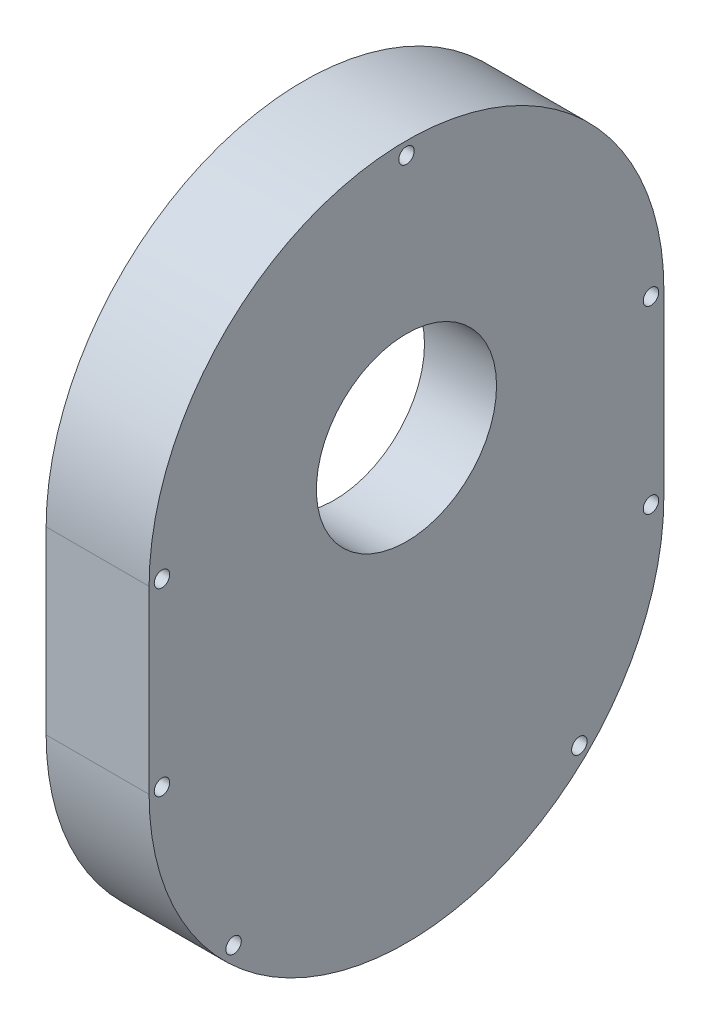
ISO-10303-21;
HEADER;
FILE_DESCRIPTION(('STEP AP214'),'2;1');
FILE_NAME('part.step','',(''),(''),'','','');
FILE_SCHEMA(('AUTOMOTIVE_DESIGN { 1 0 10303 214 1 1 1 1 }'));
ENDSEC;
DATA;
#1=APPLICATION_CONTEXT('core data for automotive mechanical design processes');
#2=APPLICATION_PROTOCOL_DEFINITION('international standard','automotive_design',2000,#1);
#3=PRODUCT_CONTEXT('',#1,'mechanical');
#4=PRODUCT('Part','Part','',(#3));
#5=PRODUCT_RELATED_PRODUCT_CATEGORY('part','',(#4));
#6=PRODUCT_DEFINITION_FORMATION('','',#4);
#7=PRODUCT_DEFINITION_CONTEXT('part definition',#1,'design');
#8=PRODUCT_DEFINITION('design','',#6,#7);
#9=PRODUCT_DEFINITION_SHAPE('','',#8);
#10=(LENGTH_UNIT() NAMED_UNIT(*) SI_UNIT(.MILLI.,.METRE.));
#11=(NAMED_UNIT(*) PLANE_ANGLE_UNIT() SI_UNIT($,.RADIAN.));
#12=(NAMED_UNIT(*) SI_UNIT($,.STERADIAN.) SOLID_ANGLE_UNIT());
#13=UNCERTAINTY_MEASURE_WITH_UNIT(LENGTH_MEASURE(1.E-05),#10,'distance_accuracy_value','');
#14=(GEOMETRIC_REPRESENTATION_CONTEXT(3) GLOBAL_UNCERTAINTY_ASSIGNED_CONTEXT((#13)) GLOBAL_UNIT_ASSIGNED_CONTEXT((#10,
#11,#12)) REPRESENTATION_CONTEXT('',''));
#15=CARTESIAN_POINT('',(0.,0.,0.));
#16=DIRECTION('',(0.,0.,1.));
#17=DIRECTION('',(1.,0.,0.));
#18=AXIS2_PLACEMENT_3D('',#15,#16,#17);
#19=CARTESIAN_POINT('',(0.,35.,0.));
#20=DIRECTION('',(1.,0.,0.));
#21=DIRECTION('',(0.,0.,-1.));
#22=AXIS2_PLACEMENT_3D('',#19,#20,#21);
#23=PLANE('',#22);
#24=CARTESIAN_POINT('',(0.,82.5,0.));
#25=DIRECTION('',(-1.,0.,0.));
#26=DIRECTION('',(0.,0.,1.));
#27=AXIS2_PLACEMENT_3D('',#24,#25,#26);
#28=CIRCLE('',#27,1.5);
#29=CARTESIAN_POINT('',(0.,82.5,1.5));
#30=VERTEX_POINT('',#29);
#31=EDGE_CURVE('E303',#30,#30,#28,.T.);
#32=ORIENTED_EDGE('',*,*,#31,.F.);
#33=EDGE_LOOP('',(#32));
#34=FACE_BOUND('',#33,.T.);
#35=CARTESIAN_POINT('',(0.,-3.31690727190098E-13,47.5));
#36=DIRECTION('',(-1.,0.,0.));
#37=DIRECTION('',(0.,0.,1.));
#38=AXIS2_PLACEMENT_3D('',#35,#36,#37);
#39=CIRCLE('',#38,1.5);
#40=CARTESIAN_POINT('',(0.,-3.31690727190098E-13,49.));
#41=VERTEX_POINT('',#40);
#42=EDGE_CURVE('E321',#41,#41,#39,.T.);
#43=ORIENTED_EDGE('',*,*,#42,.F.);
#44=EDGE_LOOP('',(#43));
#45=FACE_BOUND('',#44,.T.);
#46=CARTESIAN_POINT('',(0.,34.9999999999998,-47.4999999999993));
#47=DIRECTION('',(-1.,0.,0.));
#48=DIRECTION('',(0.,0.,1.));
#49=AXIS2_PLACEMENT_3D('',#46,#47,#48);
#50=CIRCLE('',#49,1.5);
#51=CARTESIAN_POINT('',(0.,34.9999999999998,-45.9999999999993));
#52=VERTEX_POINT('',#51);
#53=EDGE_CURVE('E315',#52,#52,#50,.T.);
#54=ORIENTED_EDGE('',*,*,#53,.F.);
#55=EDGE_LOOP('',(#54));
#56=FACE_BOUND('',#55,.T.);
#57=CARTESIAN_POINT('',(0.,35.0000000000005,47.5000000000007));
#58=DIRECTION('',(-1.,0.,0.));
#59=DIRECTION('',(0.,0.,1.));
#60=AXIS2_PLACEMENT_3D('',#57,#58,#59);
#61=CIRCLE('',#60,1.5);
#62=CARTESIAN_POINT('',(0.,35.0000000000005,49.0000000000007));
#63=VERTEX_POINT('',#62);
#64=EDGE_CURVE('E314',#63,#63,#61,.T.);
#65=ORIENTED_EDGE('',*,*,#64,.F.);
#66=EDGE_LOOP('',(#65));
#67=FACE_BOUND('',#66,.T.);
#68=CARTESIAN_POINT('',(0.,0.,-47.5));
#69=DIRECTION('',(-1.,0.,0.));
#70=DIRECTION('',(0.,0.,1.));
#71=AXIS2_PLACEMENT_3D('',#68,#69,#70);
#72=CIRCLE('',#71,1.5);
#73=CARTESIAN_POINT('',(0.,0.,-46.));
#74=VERTEX_POINT('',#73);
#75=EDGE_CURVE('E308',#74,#74,#72,.T.);
#76=ORIENTED_EDGE('',*,*,#75,.F.);
#77=EDGE_LOOP('',(#76));
#78=FACE_BOUND('',#77,.T.);
#79=CARTESIAN_POINT('',(0.,-33.5875721063613,33.5875721063607));
#80=DIRECTION('',(-1.,0.,0.));
#81=DIRECTION('',(0.,0.,1.));
#82=AXIS2_PLACEMENT_3D('',#79,#80,#81);
#83=CIRCLE('',#82,1.50000000000001);
#84=CARTESIAN_POINT('',(0.,-33.5875721063613,35.0875721063607));
#85=VERTEX_POINT('',#84);
#86=EDGE_CURVE('E334',#85,#85,#83,.T.);
#87=ORIENTED_EDGE('',*,*,#86,.F.);
#88=EDGE_LOOP('',(#87));
#89=FACE_BOUND('',#88,.T.);
#90=CARTESIAN_POINT('',(0.,-33.5875721063606,-33.5875721063614));
#91=DIRECTION('',(-1.,0.,0.));
#92=DIRECTION('',(0.,0.,1.));
#93=AXIS2_PLACEMENT_3D('',#90,#91,#92);
#94=CIRCLE('',#93,1.50000000000001);
#95=CARTESIAN_POINT('',(0.,-33.5875721063606,-32.0875721063614));
#96=VERTEX_POINT('',#95);
#97=EDGE_CURVE('E339',#96,#96,#94,.T.);
#98=ORIENTED_EDGE('',*,*,#97,.F.);
#99=EDGE_LOOP('',(#98));
#100=FACE_BOUND('',#99,.T.);
#101=CARTESIAN_POINT('',(0.,35.,0.));
#102=DIRECTION('',(1.,0.,0.));
#103=DIRECTION('',(0.,0.,-1.));
#104=AXIS2_PLACEMENT_3D('',#101,#102,#103);
#105=CIRCLE('',#104,30.);
#106=CARTESIAN_POINT('',(0.,35.,-30.));
#107=VERTEX_POINT('',#106);
#108=EDGE_CURVE('E105',#107,#107,#105,.T.);
#109=ORIENTED_EDGE('',*,*,#108,.T.);
#110=EDGE_LOOP('',(#109));
#111=FACE_BOUND('',#110,.T.);
#112=DIRECTION('',(0.,-1.,0.));
#113=VECTOR('',#112,1.);
#114=CARTESIAN_POINT('',(0.,-40.,6.61437827766147));
#115=LINE('',#114,#113);
#116=CARTESIAN_POINT('',(0.,-49.5605690039975,6.61437827766147));
#117=VERTEX_POINT('',#116);
#118=CARTESIAN_POINT('',(0.,-40.,6.61437827766147));
#119=VERTEX_POINT('',#118);
#120=EDGE_CURVE('E95',#117,#119,#115,.F.);
#121=ORIENTED_EDGE('',*,*,#120,.F.);
#122=CARTESIAN_POINT('',(0.,0.,0.));
#123=DIRECTION('',(1.,0.,0.));
#124=DIRECTION('',(0.,0.,-1.));
#125=AXIS2_PLACEMENT_3D('',#122,#123,#124);
#126=CIRCLE('',#125,50.);
#127=CARTESIAN_POINT('',(0.,0.,50.));
#128=VERTEX_POINT('',#127);
#129=EDGE_CURVE('E136',#128,#117,#126,.T.);
#130=ORIENTED_EDGE('',*,*,#129,.F.);
#131=DIRECTION('',(0.,-1.,0.));
#132=VECTOR('',#131,1.);
#133=CARTESIAN_POINT('',(0.,35.,50.));
#134=LINE('',#133,#132);
#135=CARTESIAN_POINT('',(0.,35.,50.));
#136=VERTEX_POINT('',#135);
#137=EDGE_CURVE('E134',#136,#128,#134,.T.);
#138=ORIENTED_EDGE('',*,*,#137,.F.);
#139=CARTESIAN_POINT('',(0.,35.,0.));
#140=DIRECTION('',(1.,0.,0.));
#141=DIRECTION('',(0.,0.,-1.));
#142=AXIS2_PLACEMENT_3D('',#139,#140,#141);
#143=CIRCLE('',#142,50.);
#144=CARTESIAN_POINT('',(0.,35.,-50.));
#145=VERTEX_POINT('',#144);
#146=EDGE_CURVE('E124',#145,#136,#143,.T.);
#147=ORIENTED_EDGE('',*,*,#146,.F.);
#148=DIRECTION('',(0.,1.,0.));
#149=VECTOR('',#148,1.);
#150=CARTESIAN_POINT('',(0.,35.,-50.));
#151=LINE('',#150,#149);
#152=CARTESIAN_POINT('',(0.,0.,-50.));
#153=VERTEX_POINT('',#152);
#154=EDGE_CURVE('E74',#153,#145,#151,.T.);
#155=ORIENTED_EDGE('',*,*,#154,.F.);
#156=CARTESIAN_POINT('',(0.,-49.5605690039975,-6.61437827766146));
#157=VERTEX_POINT('',#156);
#158=EDGE_CURVE('E68',#157,#153,#126,.T.);
#159=ORIENTED_EDGE('',*,*,#158,.F.);
#160=DIRECTION('',(0.,-1.,0.));
#161=VECTOR('',#160,1.);
#162=CARTESIAN_POINT('',(0.,-40.,-6.61437827766146));
#163=LINE('',#162,#161);
#164=CARTESIAN_POINT('',(0.,-40.,-6.61437827766146));
#165=VERTEX_POINT('',#164);
#166=EDGE_CURVE('E106',#165,#157,#163,.T.);
#167=ORIENTED_EDGE('',*,*,#166,.F.);
#168=DIRECTION('',(0.,0.,-1.));
#169=VECTOR('',#168,1.);
#170=CARTESIAN_POINT('',(0.,-40.,0.));
#171=LINE('',#170,#169);
#172=EDGE_CURVE('E11',#119,#165,#171,.T.);
#173=ORIENTED_EDGE('',*,*,#172,.F.);
#174=EDGE_LOOP('',(#121,#130,#138,#147,#155,#159,#167,#173));
#175=FACE_BOUND('',#174,.T.);
#176=ADVANCED_FACE('F33',(#34,#45,#56,#67,#78,#89,#100,#111,#175),#23,.F.);
#177=CARTESIAN_POINT('',(20.,0.,0.));
#178=DIRECTION('',(-1.,0.,0.));
#179=DIRECTION('',(0.,0.,1.));
#180=AXIS2_PLACEMENT_3D('',#177,#178,#179);
#181=CYLINDRICAL_SURFACE('',#180,50.);
#182=CARTESIAN_POINT('',(0.,-49.5605690039975,-6.61437827766146));
#183=CARTESIAN_POINT('',(0.184828214011511,-49.5885429846224,-6.40484187591998));
#184=CARTESIAN_POINT('',(0.360858876319188,-49.6161885085382,-6.18750033277234));
#185=CARTESIAN_POINT('',(0.694200949979382,-49.6700892244158,-5.73873352223707));
#186=CARTESIAN_POINT('',(0.851511691028891,-49.6963443665735,-5.50730775098457));
#187=CARTESIAN_POINT('',(1.14628106242146,-49.7467295928045,-5.0319067127722));
#188=CARTESIAN_POINT('',(1.28373906195998,-49.7708596093443,-4.78793104738365));
#189=CARTESIAN_POINT('',(1.53780131993583,-49.8163248151024,-4.28911133531483));
#190=CARTESIAN_POINT('',(1.65440628608987,-49.8376600991627,-4.0342676578402));
#191=CARTESIAN_POINT('',(1.86599724196084,-49.8769594248589,-3.5152126709044));
#192=CARTESIAN_POINT('',(1.96096211448273,-49.8949201705234,-3.25099249956441));
#193=CARTESIAN_POINT('',(2.12839527245453,-49.9269389859154,-2.71528226395152));
#194=CARTESIAN_POINT('',(2.20086339461914,-49.9409970273163,-2.44379214692764));
#195=CARTESIAN_POINT('',(2.32269264095945,-49.9648048076033,-1.89565018492675));
#196=CARTESIAN_POINT('',(2.37206684124951,-49.9745569843569,-1.61900135339472));
#197=CARTESIAN_POINT('',(2.44736872212528,-49.9894866816081,-1.06241132452976));
#198=CARTESIAN_POINT('',(2.47329683830871,-49.9946642870952,-0.78247018846146));
#199=CARTESIAN_POINT('',(2.50131498163594,-50.0002611705518,-0.224950056510154));
#200=CARTESIAN_POINT('',(2.50370622988623,-50.0007405750065,0.0526132383250897));
#201=CARTESIAN_POINT('',(2.48541529806449,-49.9970842986336,0.606947631363445));
#202=CARTESIAN_POINT('',(2.46473319889358,-49.9929486339875,0.883718732340783));
#203=CARTESIAN_POINT('',(2.40044476211794,-49.9801742312364,1.43462218274366));
#204=CARTESIAN_POINT('',(2.35682673191133,-49.9715331963393,1.70875311357345));
#205=CARTESIAN_POINT('',(2.24700640051275,-49.9499873759771,2.25227282879528));
#206=CARTESIAN_POINT('',(2.18080473314482,-49.9370827101739,2.52166174605182));
#207=CARTESIAN_POINT('',(2.02662286131678,-49.9074227704483,3.05280919474107));
#208=CARTESIAN_POINT('',(1.93872555892036,-49.8906821712235,3.31459262774161));
#209=CARTESIAN_POINT('',(1.74168850815615,-49.8537806812045,3.82978490166161));
#210=CARTESIAN_POINT('',(1.63254905076324,-49.8336198372613,4.08319385723898));
#211=CARTESIAN_POINT('',(1.39397011536482,-49.7904505133023,4.5796351747907));
#212=CARTESIAN_POINT('',(1.26455472755156,-49.7674454193443,4.82267942078418));
#213=CARTESIAN_POINT('',(0.986291779830318,-49.7191954185522,5.29701893479065));
#214=CARTESIAN_POINT('',(0.83745299561471,-49.6939515248717,5.52831944358127));
#215=CARTESIAN_POINT('',(0.574046469793252,-49.6505732971053,5.90282442406667));
#216=CARTESIAN_POINT('',(0.464586095505832,-49.6328730001399,6.04970089530807));
#217=CARTESIAN_POINT('',(0.237996034832481,-49.5970170813875,6.336941689071));
#218=CARTESIAN_POINT('',(0.120879880715073,-49.578862296229,6.47731679082717));
#219=CARTESIAN_POINT('',(0.,-49.5605690039975,6.61437827766147));
#220=B_SPLINE_CURVE_WITH_KNOTS('',3,(#182,#183,#184,#185,#186,#187,#188,#189,#190,#191,#192,
#193,#194,#195,#196,#197,#198,#199,#200,#201,#202,#203,#204,#205,#206,#207,#208,#209,#210,#211,
#212,#213,#214,#215,#216,#217,#218,#219),.UNSPECIFIED.,.F.,.F.,(4,2,2,2,2,2,2,2,2,2,2,2,2,2,2,2,
2,2,4),(0.,0.842162977024116,1.68435610025556,2.52657597759654,3.36876726599197,
4.21177690923805,5.05479267104999,5.89733052551683,6.73985272640584,7.57157822269753,
8.40330080275406,9.23544780171869,10.0675714478731,10.8965633644329,11.7255439262666,
12.5535469280851,13.3811771164208,13.9330146195742,14.4839017809121),.UNSPECIFIED.);
#221=EDGE_CURVE('E42',#157,#117,#220,.T.);
#222=ORIENTED_EDGE('',*,*,#221,.F.);
#223=ORIENTED_EDGE('',*,*,#158,.T.);
#224=DIRECTION('',(-1.,0.,0.));
#225=VECTOR('',#224,1.);
#226=CARTESIAN_POINT('',(20.,0.,-50.));
#227=LINE('',#226,#225);
#228=CARTESIAN_POINT('',(20.,0.,-50.));
#229=VERTEX_POINT('',#228);
#230=EDGE_CURVE('E140',#229,#153,#227,.T.);
#231=ORIENTED_EDGE('',*,*,#230,.F.);
#232=CARTESIAN_POINT('',(20.,0.,0.));
#233=DIRECTION('',(1.,0.,0.));
#234=DIRECTION('',(0.,0.,-1.));
#235=AXIS2_PLACEMENT_3D('',#232,#233,#234);
#236=CIRCLE('',#235,50.);
#237=CARTESIAN_POINT('',(20.,0.,50.));
#238=VERTEX_POINT('',#237);
#239=EDGE_CURVE('E128',#238,#229,#236,.T.);
#240=ORIENTED_EDGE('',*,*,#239,.F.);
#241=DIRECTION('',(-1.,0.,0.));
#242=VECTOR('',#241,1.);
#243=CARTESIAN_POINT('',(20.,0.,50.));
#244=LINE('',#243,#242);
#245=EDGE_CURVE('E142',#238,#128,#244,.T.);
#246=ORIENTED_EDGE('',*,*,#245,.T.);
#247=ORIENTED_EDGE('',*,*,#129,.T.);
#248=EDGE_LOOP('',(#222,#223,#231,#240,#246,#247));
#249=FACE_BOUND('',#248,.T.);
#250=ADVANCED_FACE('F154',(#249),#181,.T.);
#251=CARTESIAN_POINT('',(20.,35.,0.));
#252=DIRECTION('',(1.,0.,0.));
#253=DIRECTION('',(0.,0.,-1.));
#254=AXIS2_PLACEMENT_3D('',#251,#252,#253);
#255=PLANE('',#254);
#256=CARTESIAN_POINT('',(20.,82.5,0.));
#257=DIRECTION('',(-1.,0.,0.));
#258=DIRECTION('',(0.,0.,1.));
#259=AXIS2_PLACEMENT_3D('',#256,#257,#258);
#260=CIRCLE('',#259,1.5);
#261=CARTESIAN_POINT('',(20.,82.5,1.5));
#262=VERTEX_POINT('',#261);
#263=EDGE_CURVE('E110',#262,#262,#260,.T.);
#264=ORIENTED_EDGE('',*,*,#263,.T.);
#265=EDGE_LOOP('',(#264));
#266=FACE_BOUND('',#265,.T.);
#267=CARTESIAN_POINT('',(20.,-3.31690727190098E-13,47.5));
#268=DIRECTION('',(-1.,0.,0.));
#269=DIRECTION('',(0.,0.,1.));
#270=AXIS2_PLACEMENT_3D('',#267,#268,#269);
#271=CIRCLE('',#270,1.5);
#272=CARTESIAN_POINT('',(20.,-3.31690727190098E-13,49.));
#273=VERTEX_POINT('',#272);
#274=EDGE_CURVE('E318',#273,#273,#271,.T.);
#275=ORIENTED_EDGE('',*,*,#274,.T.);
#276=EDGE_LOOP('',(#275));
#277=FACE_BOUND('',#276,.T.);
#278=CARTESIAN_POINT('',(20.,34.9999999999998,-47.4999999999993));
#279=DIRECTION('',(-1.,0.,0.));
#280=DIRECTION('',(0.,0.,1.));
#281=AXIS2_PLACEMENT_3D('',#278,#279,#280);
#282=CIRCLE('',#281,1.5);
#283=CARTESIAN_POINT('',(20.,34.9999999999998,-45.9999999999993));
#284=VERTEX_POINT('',#283);
#285=EDGE_CURVE('E311',#284,#284,#282,.T.);
#286=ORIENTED_EDGE('',*,*,#285,.T.);
#287=EDGE_LOOP('',(#286));
#288=FACE_BOUND('',#287,.T.);
#289=CARTESIAN_POINT('',(20.,35.0000000000005,47.5000000000007));
#290=DIRECTION('',(-1.,0.,0.));
#291=DIRECTION('',(0.,0.,1.));
#292=AXIS2_PLACEMENT_3D('',#289,#290,#291);
#293=CIRCLE('',#292,1.5);
#294=CARTESIAN_POINT('',(20.,35.0000000000005,49.0000000000007));
#295=VERTEX_POINT('',#294);
#296=EDGE_CURVE('E327',#295,#295,#293,.T.);
#297=ORIENTED_EDGE('',*,*,#296,.T.);
#298=EDGE_LOOP('',(#297));
#299=FACE_BOUND('',#298,.T.);
#300=CARTESIAN_POINT('',(20.,0.,-47.5));
#301=DIRECTION('',(-1.,0.,0.));
#302=DIRECTION('',(0.,0.,1.));
#303=AXIS2_PLACEMENT_3D('',#300,#301,#302);
#304=CIRCLE('',#303,1.5);
#305=CARTESIAN_POINT('',(20.,0.,-46.));
#306=VERTEX_POINT('',#305);
#307=EDGE_CURVE('E304',#306,#306,#304,.T.);
#308=ORIENTED_EDGE('',*,*,#307,.T.);
#309=EDGE_LOOP('',(#308));
#310=FACE_BOUND('',#309,.T.);
#311=CARTESIAN_POINT('',(20.,-33.5875721063613,33.5875721063607));
#312=DIRECTION('',(-1.,0.,0.));
#313=DIRECTION('',(0.,0.,1.));
#314=AXIS2_PLACEMENT_3D('',#311,#312,#313);
#315=CIRCLE('',#314,1.50000000000001);
#316=CARTESIAN_POINT('',(20.,-33.5875721063613,35.0875721063607));
#317=VERTEX_POINT('',#316);
#318=EDGE_CURVE('E323',#317,#317,#315,.T.);
#319=ORIENTED_EDGE('',*,*,#318,.T.);
#320=EDGE_LOOP('',(#319));
#321=FACE_BOUND('',#320,.T.);
#322=CARTESIAN_POINT('',(20.,-33.5875721063606,-33.5875721063614));
#323=DIRECTION('',(-1.,0.,0.));
#324=DIRECTION('',(0.,0.,1.));
#325=AXIS2_PLACEMENT_3D('',#322,#323,#324);
#326=CIRCLE('',#325,1.50000000000001);
#327=CARTESIAN_POINT('',(20.,-33.5875721063606,-32.0875721063614));
#328=VERTEX_POINT('',#327);
#329=EDGE_CURVE('E337',#328,#328,#326,.T.);
#330=ORIENTED_EDGE('',*,*,#329,.T.);
#331=EDGE_LOOP('',(#330));
#332=FACE_BOUND('',#331,.T.);
#333=CARTESIAN_POINT('',(20.,35.,0.));
#334=DIRECTION('',(1.,0.,0.));
#335=DIRECTION('',(0.,0.,-1.));
#336=AXIS2_PLACEMENT_3D('',#333,#334,#335);
#337=CIRCLE('',#336,50.);
#338=CARTESIAN_POINT('',(20.,35.,-50.));
#339=VERTEX_POINT('',#338);
#340=CARTESIAN_POINT('',(20.,35.,50.));
#341=VERTEX_POINT('',#340);
#342=EDGE_CURVE('E125',#339,#341,#337,.T.);
#343=ORIENTED_EDGE('',*,*,#342,.T.);
#344=DIRECTION('',(0.,-1.,0.));
#345=VECTOR('',#344,1.);
#346=CARTESIAN_POINT('',(20.,35.,50.));
#347=LINE('',#346,#345);
#348=EDGE_CURVE('E82',#341,#238,#347,.T.);
#349=ORIENTED_EDGE('',*,*,#348,.T.);
#350=ORIENTED_EDGE('',*,*,#239,.T.);
#351=DIRECTION('',(0.,1.,0.));
#352=VECTOR('',#351,1.);
#353=CARTESIAN_POINT('',(20.,35.,-50.));
#354=LINE('',#353,#352);
#355=EDGE_CURVE('E50',#229,#339,#354,.T.);
#356=ORIENTED_EDGE('',*,*,#355,.T.);
#357=EDGE_LOOP('',(#343,#349,#350,#356));
#358=FACE_BOUND('',#357,.T.);
#359=CARTESIAN_POINT('',(20.,35.,0.));
#360=DIRECTION('',(1.,0.,0.));
#361=DIRECTION('',(0.,0.,-1.));
#362=AXIS2_PLACEMENT_3D('',#359,#360,#361);
#363=CIRCLE('',#362,17.5);
#364=CARTESIAN_POINT('',(20.,35.,-17.5));
#365=VERTEX_POINT('',#364);
#366=EDGE_CURVE('E121',#365,#365,#363,.T.);
#367=ORIENTED_EDGE('',*,*,#366,.F.);
#368=EDGE_LOOP('',(#367));
#369=FACE_BOUND('',#368,.T.);
#370=ADVANCED_FACE('F176',(#266,#277,#288,#299,#310,#321,#332,#358,#369),#255,.T.);
#371=CARTESIAN_POINT('',(20.,35.,0.));
#372=DIRECTION('',(-1.,0.,0.));
#373=DIRECTION('',(0.,0.,1.));
#374=AXIS2_PLACEMENT_3D('',#371,#372,#373);
#375=CYLINDRICAL_SURFACE('',#374,50.);
#376=ORIENTED_EDGE('',*,*,#146,.T.);
#377=DIRECTION('',(-1.,0.,0.));
#378=VECTOR('',#377,1.);
#379=CARTESIAN_POINT('',(20.,35.,50.));
#380=LINE('',#379,#378);
#381=EDGE_CURVE('E145',#341,#136,#380,.T.);
#382=ORIENTED_EDGE('',*,*,#381,.F.);
#383=ORIENTED_EDGE('',*,*,#342,.F.);
#384=DIRECTION('',(-1.,0.,0.));
#385=VECTOR('',#384,1.);
#386=CARTESIAN_POINT('',(20.,35.,-50.));
#387=LINE('',#386,#385);
#388=EDGE_CURVE('E131',#339,#145,#387,.T.);
#389=ORIENTED_EDGE('',*,*,#388,.T.);
#390=EDGE_LOOP('',(#376,#382,#383,#389));
#391=FACE_BOUND('',#390,.T.);
#392=ADVANCED_FACE('F35',(#391),#375,.T.);
#393=CARTESIAN_POINT('',(20.,35.,50.));
#394=DIRECTION('',(0.,0.,-1.));
#395=DIRECTION('',(-1.,0.,0.));
#396=AXIS2_PLACEMENT_3D('',#393,#394,#395);
#397=PLANE('',#396);
#398=ORIENTED_EDGE('',*,*,#137,.T.);
#399=ORIENTED_EDGE('',*,*,#245,.F.);
#400=ORIENTED_EDGE('',*,*,#348,.F.);
#401=ORIENTED_EDGE('',*,*,#381,.T.);
#402=EDGE_LOOP('',(#398,#399,#400,#401));
#403=FACE_BOUND('',#402,.T.);
#404=ADVANCED_FACE('F183',(#403),#397,.F.);
#405=CARTESIAN_POINT('',(20.,35.,-50.));
#406=DIRECTION('',(0.,0.,1.));
#407=DIRECTION('',(1.,0.,0.));
#408=AXIS2_PLACEMENT_3D('',#405,#406,#407);
#409=PLANE('',#408);
#410=ORIENTED_EDGE('',*,*,#154,.T.);
#411=ORIENTED_EDGE('',*,*,#388,.F.);
#412=ORIENTED_EDGE('',*,*,#355,.F.);
#413=ORIENTED_EDGE('',*,*,#230,.T.);
#414=EDGE_LOOP('',(#410,#411,#412,#413));
#415=FACE_BOUND('',#414,.T.);
#416=ADVANCED_FACE('F174',(#415),#409,.F.);
#417=CARTESIAN_POINT('',(20.,35.,0.));
#418=DIRECTION('',(-1.,0.,0.));
#419=DIRECTION('',(0.,0.,1.));
#420=AXIS2_PLACEMENT_3D('',#417,#418,#419);
#421=CYLINDRICAL_SURFACE('',#420,17.5);
#422=CARTESIAN_POINT('',(6.,35.,0.));
#423=DIRECTION('',(1.,0.,0.));
#424=DIRECTION('',(0.,0.,-1.));
#425=AXIS2_PLACEMENT_3D('',#422,#423,#424);
#426=CIRCLE('',#425,17.5);
#427=CARTESIAN_POINT('',(6.,35.,-17.5));
#428=VERTEX_POINT('',#427);
#429=EDGE_CURVE('E118',#428,#428,#426,.T.);
#430=ORIENTED_EDGE('',*,*,#429,.F.);
#431=EDGE_LOOP('',(#430));
#432=FACE_BOUND('',#431,.T.);
#433=ORIENTED_EDGE('',*,*,#366,.T.);
#434=EDGE_LOOP('',(#433));
#435=FACE_BOUND('',#434,.T.);
#436=ADVANCED_FACE('F170',(#432,#435),#421,.F.);
#437=CARTESIAN_POINT('',(6.,35.,0.));
#438=DIRECTION('',(-1.,0.,0.));
#439=DIRECTION('',(0.,0.,1.));
#440=AXIS2_PLACEMENT_3D('',#437,#438,#439);
#441=CYLINDRICAL_SURFACE('',#440,30.);
#442=CARTESIAN_POINT('',(6.,35.,0.));
#443=DIRECTION('',(1.,0.,0.));
#444=DIRECTION('',(0.,0.,-1.));
#445=AXIS2_PLACEMENT_3D('',#442,#443,#444);
#446=CIRCLE('',#445,30.);
#447=CARTESIAN_POINT('',(6.,35.,-30.));
#448=VERTEX_POINT('',#447);
#449=EDGE_CURVE('E115',#448,#448,#446,.T.);
#450=ORIENTED_EDGE('',*,*,#449,.T.);
#451=EDGE_LOOP('',(#450));
#452=FACE_BOUND('',#451,.T.);
#453=ORIENTED_EDGE('',*,*,#108,.F.);
#454=EDGE_LOOP('',(#453));
#455=FACE_BOUND('',#454,.T.);
#456=ADVANCED_FACE('F166',(#452,#455),#441,.F.);
#457=CARTESIAN_POINT('',(6.,35.,0.));
#458=DIRECTION('',(1.,0.,0.));
#459=DIRECTION('',(0.,0.,-1.));
#460=AXIS2_PLACEMENT_3D('',#457,#458,#459);
#461=PLANE('',#460);
#462=ORIENTED_EDGE('',*,*,#429,.T.);
#463=EDGE_LOOP('',(#462));
#464=FACE_BOUND('',#463,.T.);
#465=ORIENTED_EDGE('',*,*,#449,.F.);
#466=EDGE_LOOP('',(#465));
#467=FACE_BOUND('',#466,.T.);
#468=ADVANCED_FACE('F163',(#464,#467),#461,.F.);
#469=CARTESIAN_POINT('',(-7.5,-40.,0.));
#470=DIRECTION('',(0.,-1.,0.));
#471=DIRECTION('',(0.,0.,-1.));
#472=AXIS2_PLACEMENT_3D('',#469,#470,#471);
#473=PLANE('',#472);
#474=ORIENTED_EDGE('',*,*,#172,.T.);
#475=CARTESIAN_POINT('',(-7.5,-40.,0.));
#476=DIRECTION('',(0.,1.,0.));
#477=DIRECTION('',(0.,0.,-1.));
#478=AXIS2_PLACEMENT_3D('',#475,#476,#477);
#479=CIRCLE('',#478,10.);
#480=EDGE_CURVE('E99',#119,#165,#479,.T.);
#481=ORIENTED_EDGE('',*,*,#480,.F.);
#482=EDGE_LOOP('',(#474,#481));
#483=FACE_BOUND('',#482,.T.);
#484=ADVANCED_FACE('F109',(#483),#473,.T.);
#485=CARTESIAN_POINT('',(-7.5,-40.,0.));
#486=DIRECTION('',(0.,-1.,0.));
#487=DIRECTION('',(0.,0.,-1.));
#488=AXIS2_PLACEMENT_3D('',#485,#486,#487);
#489=CYLINDRICAL_SURFACE('',#488,10.);
#490=ORIENTED_EDGE('',*,*,#120,.T.);
#491=ORIENTED_EDGE('',*,*,#480,.T.);
#492=ORIENTED_EDGE('',*,*,#166,.T.);
#493=ORIENTED_EDGE('',*,*,#221,.T.);
#494=EDGE_LOOP('',(#490,#491,#492,#493));
#495=FACE_BOUND('',#494,.T.);
#496=ADVANCED_FACE('F97',(#495),#489,.F.);
#497=CARTESIAN_POINT('',(20.,-33.5875721063606,-33.5875721063614));
#498=DIRECTION('',(-1.,0.,0.));
#499=DIRECTION('',(0.,0.,1.));
#500=AXIS2_PLACEMENT_3D('',#497,#498,#499);
#501=CYLINDRICAL_SURFACE('',#500,1.50000000000001);
#502=ORIENTED_EDGE('',*,*,#329,.F.);
#503=EDGE_LOOP('',(#502));
#504=FACE_BOUND('',#503,.T.);
#505=ORIENTED_EDGE('',*,*,#97,.T.);
#506=EDGE_LOOP('',(#505));
#507=FACE_BOUND('',#506,.T.);
#508=ADVANCED_FACE('F161',(#504,#507),#501,.F.);
#509=CARTESIAN_POINT('',(20.,-33.5875721063613,33.5875721063607));
#510=DIRECTION('',(-1.,0.,0.));
#511=DIRECTION('',(0.,0.,1.));
#512=AXIS2_PLACEMENT_3D('',#509,#510,#511);
#513=CYLINDRICAL_SURFACE('',#512,1.50000000000001);
#514=ORIENTED_EDGE('',*,*,#318,.F.);
#515=EDGE_LOOP('',(#514));
#516=FACE_BOUND('',#515,.T.);
#517=ORIENTED_EDGE('',*,*,#86,.T.);
#518=EDGE_LOOP('',(#517));
#519=FACE_BOUND('',#518,.T.);
#520=ADVANCED_FACE('F235',(#516,#519),#513,.F.);
#521=CARTESIAN_POINT('',(20.,0.,-47.5));
#522=DIRECTION('',(-1.,0.,0.));
#523=DIRECTION('',(0.,0.,1.));
#524=AXIS2_PLACEMENT_3D('',#521,#522,#523);
#525=CYLINDRICAL_SURFACE('',#524,1.5);
#526=ORIENTED_EDGE('',*,*,#307,.F.);
#527=EDGE_LOOP('',(#526));
#528=FACE_BOUND('',#527,.T.);
#529=ORIENTED_EDGE('',*,*,#75,.T.);
#530=EDGE_LOOP('',(#529));
#531=FACE_BOUND('',#530,.T.);
#532=ADVANCED_FACE('F244',(#528,#531),#525,.F.);
#533=CARTESIAN_POINT('',(20.,35.0000000000005,47.5000000000007));
#534=DIRECTION('',(-1.,0.,0.));
#535=DIRECTION('',(0.,0.,1.));
#536=AXIS2_PLACEMENT_3D('',#533,#534,#535);
#537=CYLINDRICAL_SURFACE('',#536,1.5);
#538=ORIENTED_EDGE('',*,*,#296,.F.);
#539=EDGE_LOOP('',(#538));
#540=FACE_BOUND('',#539,.T.);
#541=ORIENTED_EDGE('',*,*,#64,.T.);
#542=EDGE_LOOP('',(#541));
#543=FACE_BOUND('',#542,.T.);
#544=ADVANCED_FACE('F254',(#540,#543),#537,.F.);
#545=CARTESIAN_POINT('',(20.,34.9999999999998,-47.4999999999993));
#546=DIRECTION('',(-1.,0.,0.));
#547=DIRECTION('',(0.,0.,1.));
#548=AXIS2_PLACEMENT_3D('',#545,#546,#547);
#549=CYLINDRICAL_SURFACE('',#548,1.5);
#550=ORIENTED_EDGE('',*,*,#285,.F.);
#551=EDGE_LOOP('',(#550));
#552=FACE_BOUND('',#551,.T.);
#553=ORIENTED_EDGE('',*,*,#53,.T.);
#554=EDGE_LOOP('',(#553));
#555=FACE_BOUND('',#554,.T.);
#556=ADVANCED_FACE('F264',(#552,#555),#549,.F.);
#557=CARTESIAN_POINT('',(20.,-3.31690727190098E-13,47.5));
#558=DIRECTION('',(-1.,0.,0.));
#559=DIRECTION('',(0.,0.,1.));
#560=AXIS2_PLACEMENT_3D('',#557,#558,#559);
#561=CYLINDRICAL_SURFACE('',#560,1.5);
#562=ORIENTED_EDGE('',*,*,#274,.F.);
#563=EDGE_LOOP('',(#562));
#564=FACE_BOUND('',#563,.T.);
#565=ORIENTED_EDGE('',*,*,#42,.T.);
#566=EDGE_LOOP('',(#565));
#567=FACE_BOUND('',#566,.T.);
#568=ADVANCED_FACE('F274',(#564,#567),#561,.F.);
#569=CARTESIAN_POINT('',(20.,82.5,0.));
#570=DIRECTION('',(-1.,0.,0.));
#571=DIRECTION('',(0.,0.,1.));
#572=AXIS2_PLACEMENT_3D('',#569,#570,#571);
#573=CYLINDRICAL_SURFACE('',#572,1.5);
#574=ORIENTED_EDGE('',*,*,#263,.F.);
#575=EDGE_LOOP('',(#574));
#576=FACE_BOUND('',#575,.T.);
#577=ORIENTED_EDGE('',*,*,#31,.T.);
#578=EDGE_LOOP('',(#577));
#579=FACE_BOUND('',#578,.T.);
#580=ADVANCED_FACE('F284',(#576,#579),#573,.F.);
#581=CLOSED_SHELL('',(#176,#250,#370,#392,#404,#416,#436,#456,#468,#484,#496,#508,#520,#532,
#544,#556,#568,#580));
#582=MANIFOLD_SOLID_BREP('B2',#581);
#583=ADVANCED_BREP_SHAPE_REPRESENTATION('',(#18,#582),#14);
#584=SHAPE_DEFINITION_REPRESENTATION(#9,#583);
ENDSEC;
END-ISO-10303-21;
